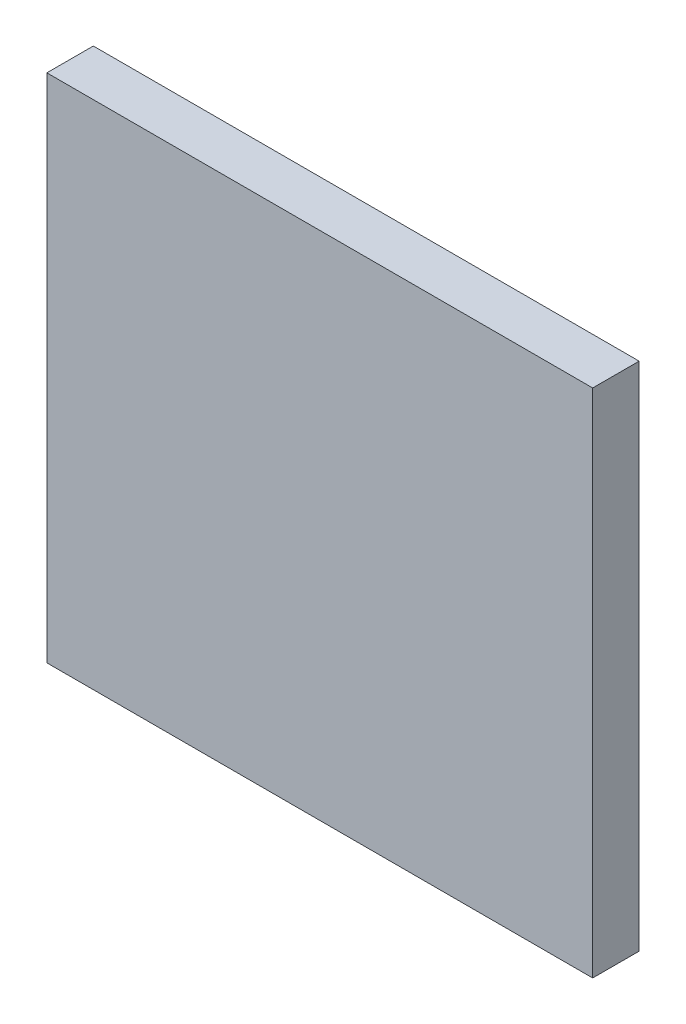
ISO-10303-21;
HEADER;
FILE_DESCRIPTION(('STEP AP214'),'2;1');
FILE_NAME('part.step','',(''),(''),'','','');
FILE_SCHEMA(('AUTOMOTIVE_DESIGN { 1 0 10303 214 1 1 1 1 }'));
ENDSEC;
DATA;
#1=APPLICATION_CONTEXT('core data for automotive mechanical design processes');
#2=APPLICATION_PROTOCOL_DEFINITION('international standard','automotive_design',2000,#1);
#3=PRODUCT_CONTEXT('',#1,'mechanical');
#4=PRODUCT('Part','Part','',(#3));
#5=PRODUCT_RELATED_PRODUCT_CATEGORY('part','',(#4));
#6=PRODUCT_DEFINITION_FORMATION('','',#4);
#7=PRODUCT_DEFINITION_CONTEXT('part definition',#1,'design');
#8=PRODUCT_DEFINITION('design','',#6,#7);
#9=PRODUCT_DEFINITION_SHAPE('','',#8);
#10=(LENGTH_UNIT() NAMED_UNIT(*) SI_UNIT(.MILLI.,.METRE.));
#11=(NAMED_UNIT(*) PLANE_ANGLE_UNIT() SI_UNIT($,.RADIAN.));
#12=(NAMED_UNIT(*) SI_UNIT($,.STERADIAN.) SOLID_ANGLE_UNIT());
#13=UNCERTAINTY_MEASURE_WITH_UNIT(LENGTH_MEASURE(1.E-05),#10,'distance_accuracy_value','');
#14=(GEOMETRIC_REPRESENTATION_CONTEXT(3) GLOBAL_UNCERTAINTY_ASSIGNED_CONTEXT((#13)) GLOBAL_UNIT_ASSIGNED_CONTEXT((#10,
#11,#12)) REPRESENTATION_CONTEXT('',''));
#15=CARTESIAN_POINT('',(0.,0.,0.));
#16=DIRECTION('',(0.,0.,1.));
#17=DIRECTION('',(1.,0.,0.));
#18=AXIS2_PLACEMENT_3D('',#15,#16,#17);
#19=CARTESIAN_POINT('',(-23.5,22.,4.));
#20=DIRECTION('',(1.,0.,0.));
#21=DIRECTION('',(0.,1.,0.));
#22=AXIS2_PLACEMENT_3D('',#19,#20,#21);
#23=PLANE('',#22);
#24=DIRECTION('',(0.,-1.,0.));
#25=VECTOR('',#24,1.);
#26=CARTESIAN_POINT('',(-23.5,22.,0.));
#27=LINE('',#26,#25);
#28=CARTESIAN_POINT('',(-23.5,22.,0.));
#29=VERTEX_POINT('',#28);
#30=CARTESIAN_POINT('',(-23.5,-22.,0.));
#31=VERTEX_POINT('',#30);
#32=EDGE_CURVE('E98',#29,#31,#27,.T.);
#33=ORIENTED_EDGE('',*,*,#32,.T.);
#34=DIRECTION('',(0.,0.,-1.));
#35=VECTOR('',#34,1.);
#36=CARTESIAN_POINT('',(-23.5,-22.,4.));
#37=LINE('',#36,#35);
#38=CARTESIAN_POINT('',(-23.5,-22.,4.));
#39=VERTEX_POINT('',#38);
#40=EDGE_CURVE('E11',#39,#31,#37,.T.);
#41=ORIENTED_EDGE('',*,*,#40,.F.);
#42=DIRECTION('',(0.,-1.,0.));
#43=VECTOR('',#42,1.);
#44=CARTESIAN_POINT('',(-23.5,22.,4.));
#45=LINE('',#44,#43);
#46=CARTESIAN_POINT('',(-23.5,22.,4.));
#47=VERTEX_POINT('',#46);
#48=EDGE_CURVE('E86',#47,#39,#45,.T.);
#49=ORIENTED_EDGE('',*,*,#48,.F.);
#50=DIRECTION('',(0.,0.,-1.));
#51=VECTOR('',#50,1.);
#52=CARTESIAN_POINT('',(-23.5,22.,4.));
#53=LINE('',#52,#51);
#54=EDGE_CURVE('E94',#47,#29,#53,.T.);
#55=ORIENTED_EDGE('',*,*,#54,.T.);
#56=EDGE_LOOP('',(#33,#41,#49,#55));
#57=FACE_BOUND('',#56,.T.);
#58=ADVANCED_FACE('F35',(#57),#23,.F.);
#59=CARTESIAN_POINT('',(-23.5,-22.,4.));
#60=DIRECTION('',(0.,1.,0.));
#61=DIRECTION('',(0.,0.,1.));
#62=AXIS2_PLACEMENT_3D('',#59,#60,#61);
#63=PLANE('',#62);
#64=DIRECTION('',(1.,0.,0.));
#65=VECTOR('',#64,1.);
#66=CARTESIAN_POINT('',(-23.5,-22.,0.));
#67=LINE('',#66,#65);
#68=CARTESIAN_POINT('',(23.5,-22.,0.));
#69=VERTEX_POINT('',#68);
#70=EDGE_CURVE('E90',#31,#69,#67,.T.);
#71=ORIENTED_EDGE('',*,*,#70,.T.);
#72=DIRECTION('',(0.,0.,-1.));
#73=VECTOR('',#72,1.);
#74=CARTESIAN_POINT('',(23.5,-22.,4.));
#75=LINE('',#74,#73);
#76=CARTESIAN_POINT('',(23.5,-22.,4.));
#77=VERTEX_POINT('',#76);
#78=EDGE_CURVE('E43',#77,#69,#75,.T.);
#79=ORIENTED_EDGE('',*,*,#78,.F.);
#80=DIRECTION('',(1.,0.,0.));
#81=VECTOR('',#80,1.);
#82=CARTESIAN_POINT('',(-23.5,-22.,4.));
#83=LINE('',#82,#81);
#84=EDGE_CURVE('E81',#39,#77,#83,.T.);
#85=ORIENTED_EDGE('',*,*,#84,.F.);
#86=ORIENTED_EDGE('',*,*,#40,.T.);
#87=EDGE_LOOP('',(#71,#79,#85,#86));
#88=FACE_BOUND('',#87,.T.);
#89=ADVANCED_FACE('F89',(#88),#63,.F.);
#90=CARTESIAN_POINT('',(23.5,22.,4.));
#91=DIRECTION('',(-1.,0.,0.));
#92=DIRECTION('',(0.,-1.,0.));
#93=AXIS2_PLACEMENT_3D('',#90,#91,#92);
#94=PLANE('',#93);
#95=DIRECTION('',(0.,1.,0.));
#96=VECTOR('',#95,1.);
#97=CARTESIAN_POINT('',(23.5,22.,0.));
#98=LINE('',#97,#96);
#99=CARTESIAN_POINT('',(23.5,22.,0.));
#100=VERTEX_POINT('',#99);
#101=EDGE_CURVE('E68',#69,#100,#98,.T.);
#102=ORIENTED_EDGE('',*,*,#101,.T.);
#103=DIRECTION('',(0.,0.,-1.));
#104=VECTOR('',#103,1.);
#105=CARTESIAN_POINT('',(23.5,22.,4.));
#106=LINE('',#105,#104);
#107=CARTESIAN_POINT('',(23.5,22.,4.));
#108=VERTEX_POINT('',#107);
#109=EDGE_CURVE('E91',#108,#100,#106,.T.);
#110=ORIENTED_EDGE('',*,*,#109,.F.);
#111=DIRECTION('',(0.,1.,0.));
#112=VECTOR('',#111,1.);
#113=CARTESIAN_POINT('',(23.5,22.,4.));
#114=LINE('',#113,#112);
#115=EDGE_CURVE('E84',#77,#108,#114,.T.);
#116=ORIENTED_EDGE('',*,*,#115,.F.);
#117=ORIENTED_EDGE('',*,*,#78,.T.);
#118=EDGE_LOOP('',(#102,#110,#116,#117));
#119=FACE_BOUND('',#118,.T.);
#120=ADVANCED_FACE('F92',(#119),#94,.F.);
#121=CARTESIAN_POINT('',(-23.5,22.,4.));
#122=DIRECTION('',(0.,-1.,0.));
#123=DIRECTION('',(0.,0.,-1.));
#124=AXIS2_PLACEMENT_3D('',#121,#122,#123);
#125=PLANE('',#124);
#126=DIRECTION('',(-1.,0.,0.));
#127=VECTOR('',#126,1.);
#128=CARTESIAN_POINT('',(-23.5,22.,0.));
#129=LINE('',#128,#127);
#130=EDGE_CURVE('E74',#100,#29,#129,.T.);
#131=ORIENTED_EDGE('',*,*,#130,.T.);
#132=ORIENTED_EDGE('',*,*,#54,.F.);
#133=DIRECTION('',(-1.,0.,0.));
#134=VECTOR('',#133,1.);
#135=CARTESIAN_POINT('',(-23.5,22.,4.));
#136=LINE('',#135,#134);
#137=EDGE_CURVE('E51',#108,#47,#136,.T.);
#138=ORIENTED_EDGE('',*,*,#137,.F.);
#139=ORIENTED_EDGE('',*,*,#109,.T.);
#140=EDGE_LOOP('',(#131,#132,#138,#139));
#141=FACE_BOUND('',#140,.T.);
#142=ADVANCED_FACE('F105',(#141),#125,.F.);
#143=CARTESIAN_POINT('',(0.,0.,4.));
#144=DIRECTION('',(0.,0.,1.));
#145=DIRECTION('',(1.,0.,0.));
#146=AXIS2_PLACEMENT_3D('',#143,#144,#145);
#147=PLANE('',#146);
#148=ORIENTED_EDGE('',*,*,#48,.T.);
#149=ORIENTED_EDGE('',*,*,#84,.T.);
#150=ORIENTED_EDGE('',*,*,#115,.T.);
#151=ORIENTED_EDGE('',*,*,#137,.T.);
#152=EDGE_LOOP('',(#148,#149,#150,#151));
#153=FACE_BOUND('',#152,.T.);
#154=ADVANCED_FACE('F82',(#153),#147,.T.);
#155=CARTESIAN_POINT('',(0.,0.,0.));
#156=DIRECTION('',(0.,0.,1.));
#157=DIRECTION('',(1.,0.,0.));
#158=AXIS2_PLACEMENT_3D('',#155,#156,#157);
#159=PLANE('',#158);
#160=ORIENTED_EDGE('',*,*,#32,.F.);
#161=ORIENTED_EDGE('',*,*,#130,.F.);
#162=ORIENTED_EDGE('',*,*,#101,.F.);
#163=ORIENTED_EDGE('',*,*,#70,.F.);
#164=EDGE_LOOP('',(#160,#161,#162,#163));
#165=FACE_BOUND('',#164,.T.);
#166=ADVANCED_FACE('F108',(#165),#159,.F.);
#167=CLOSED_SHELL('',(#58,#89,#120,#142,#154,#166));
#168=MANIFOLD_SOLID_BREP('B2',#167);
#169=ADVANCED_BREP_SHAPE_REPRESENTATION('',(#18,#168),#14);
#170=SHAPE_DEFINITION_REPRESENTATION(#9,#169);
ENDSEC;
END-ISO-10303-21;
